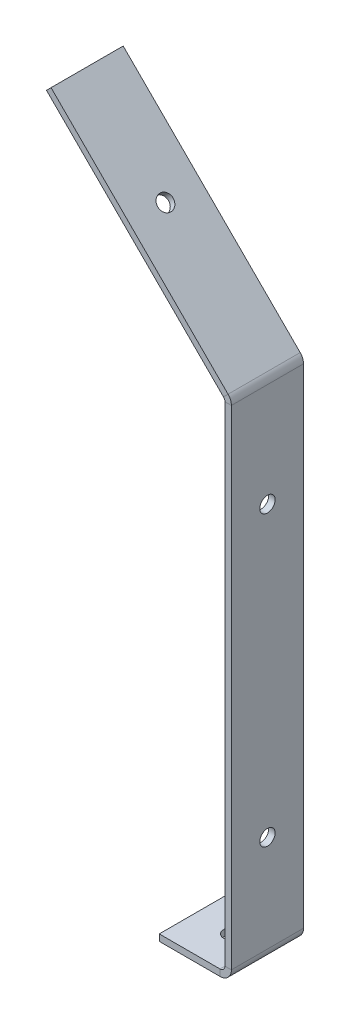
ISO-10303-21;
HEADER;
FILE_DESCRIPTION(('STEP AP214'),'2;1');
FILE_NAME('part.step','',(''),(''),'','','');
FILE_SCHEMA(('AUTOMOTIVE_DESIGN { 1 0 10303 214 1 1 1 1 }'));
ENDSEC;
DATA;
#1=APPLICATION_CONTEXT('core data for automotive mechanical design processes');
#2=APPLICATION_PROTOCOL_DEFINITION('international standard','automotive_design',2000,#1);
#3=PRODUCT_CONTEXT('',#1,'mechanical');
#4=PRODUCT('Part','Part','',(#3));
#5=PRODUCT_RELATED_PRODUCT_CATEGORY('part','',(#4));
#6=PRODUCT_DEFINITION_FORMATION('','',#4);
#7=PRODUCT_DEFINITION_CONTEXT('part definition',#1,'design');
#8=PRODUCT_DEFINITION('design','',#6,#7);
#9=PRODUCT_DEFINITION_SHAPE('','',#8);
#10=(LENGTH_UNIT() NAMED_UNIT(*) SI_UNIT(.MILLI.,.METRE.));
#11=(NAMED_UNIT(*) PLANE_ANGLE_UNIT() SI_UNIT($,.RADIAN.));
#12=(NAMED_UNIT(*) SI_UNIT($,.STERADIAN.) SOLID_ANGLE_UNIT());
#13=UNCERTAINTY_MEASURE_WITH_UNIT(LENGTH_MEASURE(1.E-05),#10,'distance_accuracy_value','');
#14=(GEOMETRIC_REPRESENTATION_CONTEXT(3) GLOBAL_UNCERTAINTY_ASSIGNED_CONTEXT((#13)) GLOBAL_UNIT_ASSIGNED_CONTEXT((#10,
#11,#12)) REPRESENTATION_CONTEXT('',''));
#15=CARTESIAN_POINT('',(0.,0.,0.));
#16=DIRECTION('',(0.,0.,1.));
#17=DIRECTION('',(1.,0.,0.));
#18=AXIS2_PLACEMENT_3D('',#15,#16,#17);
#19=CARTESIAN_POINT('',(0.,176.137678131484,25.4));
#20=DIRECTION('',(0.,0.,1.));
#21=DIRECTION('',(1.,0.,0.));
#22=AXIS2_PLACEMENT_3D('',#19,#20,#21);
#23=PLANE('',#22);
#24=DIRECTION('',(-1.,0.,0.));
#25=VECTOR('',#24,1.);
#26=CARTESIAN_POINT('',(0.,176.137678131484,25.4));
#27=LINE('',#26,#25);
#28=CARTESIAN_POINT('',(0.,176.137678131484,25.4));
#29=VERTEX_POINT('',#28);
#30=CARTESIAN_POINT('',(-2.28599999999998,176.137678131484,25.4));
#31=VERTEX_POINT('',#30);
#32=EDGE_CURVE('E11',#29,#31,#27,.T.);
#33=ORIENTED_EDGE('',*,*,#32,.F.);
#34=CARTESIAN_POINT('',(-4.01319999999998,176.137678131484,25.4));
#35=DIRECTION('',(0.,0.,1.));
#36=DIRECTION('',(1.,0.,0.));
#37=AXIS2_PLACEMENT_3D('',#34,#35,#36);
#38=CIRCLE('',#37,4.0132);
#39=CARTESIAN_POINT('',(-1.17543906574211,178.975439065742,25.4));
#40=VERTEX_POINT('',#39);
#41=EDGE_CURVE('E175',#29,#40,#38,.T.);
#42=ORIENTED_EDGE('',*,*,#41,.T.);
#43=DIRECTION('',(0.707106781186545,0.70710678118655,0.));
#44=VECTOR('',#43,1.);
#45=CARTESIAN_POINT('',(-2.79188516753455,177.35899296395,25.4));
#46=LINE('',#45,#44);
#47=CARTESIAN_POINT('',(-2.79188516753455,177.35899296395,25.4));
#48=VERTEX_POINT('',#47);
#49=EDGE_CURVE('E50',#48,#40,#46,.T.);
#50=ORIENTED_EDGE('',*,*,#49,.F.);
#51=CARTESIAN_POINT('',(-4.01319999999998,176.137678131484,25.4));
#52=DIRECTION('',(0.,0.,1.));
#53=DIRECTION('',(1.,0.,0.));
#54=AXIS2_PLACEMENT_3D('',#51,#52,#53);
#55=CIRCLE('',#54,1.7272);
#56=EDGE_CURVE('E252',#31,#48,#55,.T.);
#57=ORIENTED_EDGE('',*,*,#56,.F.);
#58=EDGE_LOOP('',(#33,#42,#50,#57));
#59=FACE_BOUND('',#58,.T.);
#60=ADVANCED_FACE('F42',(#59),#23,.T.);
#61=CARTESIAN_POINT('',(-2.79188516753455,177.35899296395,25.4));
#62=DIRECTION('',(0.,0.,1.));
#63=DIRECTION('',(1.,0.,0.));
#64=AXIS2_PLACEMENT_3D('',#61,#62,#63);
#65=PLANE('',#64);
#66=DIRECTION('',(0.,1.,0.));
#67=VECTOR('',#66,1.);
#68=CARTESIAN_POINT('',(0.,0.,25.4));
#69=LINE('',#68,#67);
#70=CARTESIAN_POINT('',(0.,4.0132,25.4));
#71=VERTEX_POINT('',#70);
#72=EDGE_CURVE('E142',#71,#29,#69,.T.);
#73=ORIENTED_EDGE('',*,*,#72,.T.);
#74=ORIENTED_EDGE('',*,*,#32,.T.);
#75=DIRECTION('',(0.,1.,0.));
#76=VECTOR('',#75,1.);
#77=CARTESIAN_POINT('',(-2.286,0.,25.4));
#78=LINE('',#77,#76);
#79=CARTESIAN_POINT('',(-2.286,4.0132,25.4));
#80=VERTEX_POINT('',#79);
#81=EDGE_CURVE('E145',#80,#31,#78,.T.);
#82=ORIENTED_EDGE('',*,*,#81,.F.);
#83=DIRECTION('',(1.,0.,0.));
#84=VECTOR('',#83,1.);
#85=CARTESIAN_POINT('',(-2.286,4.0132,25.4));
#86=LINE('',#85,#84);
#87=EDGE_CURVE('E138',#80,#71,#86,.T.);
#88=ORIENTED_EDGE('',*,*,#87,.T.);
#89=EDGE_LOOP('',(#73,#74,#82,#88));
#90=FACE_BOUND('',#89,.T.);
#91=ADVANCED_FACE('F140',(#90),#65,.T.);
#92=CARTESIAN_POINT('',(-1.17543906574211,178.975439065742,0.));
#93=DIRECTION('',(0.,0.,-1.));
#94=DIRECTION('',(-1.,0.,0.));
#95=AXIS2_PLACEMENT_3D('',#92,#93,#94);
#96=PLANE('',#95);
#97=DIRECTION('',(-0.707106781186545,-0.70710678118655,0.));
#98=VECTOR('',#97,1.);
#99=CARTESIAN_POINT('',(-1.17543906574211,178.975439065742,0.));
#100=LINE('',#99,#98);
#101=CARTESIAN_POINT('',(-1.17543906574211,178.975439065742,0.));
#102=VERTEX_POINT('',#101);
#103=CARTESIAN_POINT('',(-2.79188516753455,177.35899296395,0.));
#104=VERTEX_POINT('',#103);
#105=EDGE_CURVE('E105',#102,#104,#100,.T.);
#106=ORIENTED_EDGE('',*,*,#105,.F.);
#107=CARTESIAN_POINT('',(-4.01319999999998,176.137678131484,0.));
#108=DIRECTION('',(0.,0.,1.));
#109=DIRECTION('',(1.,0.,0.));
#110=AXIS2_PLACEMENT_3D('',#107,#108,#109);
#111=CIRCLE('',#110,4.0132);
#112=CARTESIAN_POINT('',(0.,176.137678131484,0.));
#113=VERTEX_POINT('',#112);
#114=EDGE_CURVE('E210',#113,#102,#111,.T.);
#115=ORIENTED_EDGE('',*,*,#114,.F.);
#116=DIRECTION('',(1.,0.,0.));
#117=VECTOR('',#116,1.);
#118=CARTESIAN_POINT('',(-2.28599999999998,176.137678131484,0.));
#119=LINE('',#118,#117);
#120=CARTESIAN_POINT('',(-2.28599999999998,176.137678131484,0.));
#121=VERTEX_POINT('',#120);
#122=EDGE_CURVE('E98',#121,#113,#119,.T.);
#123=ORIENTED_EDGE('',*,*,#122,.F.);
#124=CARTESIAN_POINT('',(-4.01319999999998,176.137678131484,0.));
#125=DIRECTION('',(0.,0.,1.));
#126=DIRECTION('',(1.,0.,0.));
#127=AXIS2_PLACEMENT_3D('',#124,#125,#126);
#128=CIRCLE('',#127,1.7272);
#129=EDGE_CURVE('E191',#121,#104,#128,.T.);
#130=ORIENTED_EDGE('',*,*,#129,.T.);
#131=EDGE_LOOP('',(#106,#115,#123,#130));
#132=FACE_BOUND('',#131,.T.);
#133=ADVANCED_FACE('F257',(#132),#96,.T.);
#134=CARTESIAN_POINT('',(-2.28599999999998,176.137678131484,0.));
#135=DIRECTION('',(0.,0.,-1.));
#136=DIRECTION('',(-1.,0.,0.));
#137=AXIS2_PLACEMENT_3D('',#134,#135,#136);
#138=PLANE('',#137);
#139=DIRECTION('',(-0.707106781186549,0.707106781186546,0.));
#140=VECTOR('',#139,1.);
#141=CARTESIAN_POINT('',(0.,177.8,0.));
#142=LINE('',#141,#140);
#143=CARTESIAN_POINT('',(-63.5,241.3,0.));
#144=VERTEX_POINT('',#143);
#145=EDGE_CURVE('E181',#102,#144,#142,.T.);
#146=ORIENTED_EDGE('',*,*,#145,.F.);
#147=ORIENTED_EDGE('',*,*,#105,.T.);
#148=DIRECTION('',(-0.707106781186549,0.707106781186546,0.));
#149=VECTOR('',#148,1.);
#150=CARTESIAN_POINT('',(-1.61644610179244,176.183553898208,0.));
#151=LINE('',#150,#149);
#152=CARTESIAN_POINT('',(-65.1164461017924,239.683553898207,0.));
#153=VERTEX_POINT('',#152);
#154=EDGE_CURVE('E188',#104,#153,#151,.T.);
#155=ORIENTED_EDGE('',*,*,#154,.T.);
#156=DIRECTION('',(0.707106781186545,0.707106781186551,0.));
#157=VECTOR('',#156,1.);
#158=CARTESIAN_POINT('',(-65.1164461017924,239.683553898207,0.));
#159=LINE('',#158,#157);
#160=EDGE_CURVE('E184',#153,#144,#159,.T.);
#161=ORIENTED_EDGE('',*,*,#160,.T.);
#162=EDGE_LOOP('',(#146,#147,#155,#161));
#163=FACE_BOUND('',#162,.T.);
#164=ADVANCED_FACE('F243',(#163),#138,.T.);
#165=CARTESIAN_POINT('',(-4.0132,0.,25.4));
#166=DIRECTION('',(0.,0.,1.));
#167=DIRECTION('',(1.,0.,0.));
#168=AXIS2_PLACEMENT_3D('',#165,#166,#167);
#169=PLANE('',#168);
#170=DIRECTION('',(0.,1.,0.));
#171=VECTOR('',#170,1.);
#172=CARTESIAN_POINT('',(-4.0132,0.,25.4));
#173=LINE('',#172,#171);
#174=CARTESIAN_POINT('',(-4.0132,0.,25.4));
#175=VERTEX_POINT('',#174);
#176=CARTESIAN_POINT('',(-4.0132,2.286,25.4));
#177=VERTEX_POINT('',#176);
#178=EDGE_CURVE('E150',#175,#177,#173,.T.);
#179=ORIENTED_EDGE('',*,*,#178,.F.);
#180=CARTESIAN_POINT('',(-4.0132,4.0132,25.4));
#181=DIRECTION('',(0.,0.,1.));
#182=DIRECTION('',(1.,0.,0.));
#183=AXIS2_PLACEMENT_3D('',#180,#181,#182);
#184=CIRCLE('',#183,4.0132);
#185=EDGE_CURVE('E154',#175,#71,#184,.T.);
#186=ORIENTED_EDGE('',*,*,#185,.T.);
#187=ORIENTED_EDGE('',*,*,#87,.F.);
#188=CARTESIAN_POINT('',(-4.0132,4.0132,25.4));
#189=DIRECTION('',(0.,0.,1.));
#190=DIRECTION('',(1.,0.,0.));
#191=AXIS2_PLACEMENT_3D('',#188,#189,#190);
#192=CIRCLE('',#191,1.7272);
#193=EDGE_CURVE('E264',#177,#80,#192,.T.);
#194=ORIENTED_EDGE('',*,*,#193,.F.);
#195=EDGE_LOOP('',(#179,#186,#187,#194));
#196=FACE_BOUND('',#195,.T.);
#197=ADVANCED_FACE('F156',(#196),#169,.T.);
#198=CARTESIAN_POINT('',(-2.286,4.0132,25.4));
#199=DIRECTION('',(0.,0.,1.));
#200=DIRECTION('',(1.,0.,0.));
#201=AXIS2_PLACEMENT_3D('',#198,#199,#200);
#202=PLANE('',#201);
#203=DIRECTION('',(1.,0.,0.));
#204=VECTOR('',#203,1.);
#205=CARTESIAN_POINT('',(0.,0.,25.4));
#206=LINE('',#205,#204);
#207=CARTESIAN_POINT('',(-25.4,0.,25.4));
#208=VERTEX_POINT('',#207);
#209=EDGE_CURVE('E160',#208,#175,#206,.T.);
#210=ORIENTED_EDGE('',*,*,#209,.T.);
#211=ORIENTED_EDGE('',*,*,#178,.T.);
#212=DIRECTION('',(1.,0.,0.));
#213=VECTOR('',#212,1.);
#214=CARTESIAN_POINT('',(0.,2.286,25.4));
#215=LINE('',#214,#213);
#216=CARTESIAN_POINT('',(-25.4,2.286,25.4));
#217=VERTEX_POINT('',#216);
#218=EDGE_CURVE('E271',#217,#177,#215,.T.);
#219=ORIENTED_EDGE('',*,*,#218,.F.);
#220=DIRECTION('',(0.,1.,0.));
#221=VECTOR('',#220,1.);
#222=CARTESIAN_POINT('',(-25.4,0.,25.4));
#223=LINE('',#222,#221);
#224=EDGE_CURVE('E274',#208,#217,#223,.T.);
#225=ORIENTED_EDGE('',*,*,#224,.F.);
#226=EDGE_LOOP('',(#210,#211,#219,#225));
#227=FACE_BOUND('',#226,.T.);
#228=ADVANCED_FACE('F280',(#227),#202,.T.);
#229=CARTESIAN_POINT('',(0.,4.0132,0.));
#230=DIRECTION('',(0.,0.,-1.));
#231=DIRECTION('',(-1.,0.,0.));
#232=AXIS2_PLACEMENT_3D('',#229,#230,#231);
#233=PLANE('',#232);
#234=DIRECTION('',(-1.,0.,0.));
#235=VECTOR('',#234,1.);
#236=CARTESIAN_POINT('',(0.,4.0132,0.));
#237=LINE('',#236,#235);
#238=CARTESIAN_POINT('',(0.,4.0132,0.));
#239=VERTEX_POINT('',#238);
#240=CARTESIAN_POINT('',(-2.286,4.0132,0.));
#241=VERTEX_POINT('',#240);
#242=EDGE_CURVE('E151',#239,#241,#237,.T.);
#243=ORIENTED_EDGE('',*,*,#242,.F.);
#244=CARTESIAN_POINT('',(-4.0132,4.0132,0.));
#245=DIRECTION('',(0.,0.,1.));
#246=DIRECTION('',(1.,0.,0.));
#247=AXIS2_PLACEMENT_3D('',#244,#245,#246);
#248=CIRCLE('',#247,4.0132);
#249=CARTESIAN_POINT('',(-4.0132,0.,0.));
#250=VERTEX_POINT('',#249);
#251=EDGE_CURVE('E167',#250,#239,#248,.T.);
#252=ORIENTED_EDGE('',*,*,#251,.F.);
#253=DIRECTION('',(0.,-1.,0.));
#254=VECTOR('',#253,1.);
#255=CARTESIAN_POINT('',(-4.0132,2.286,0.));
#256=LINE('',#255,#254);
#257=CARTESIAN_POINT('',(-4.0132,2.286,0.));
#258=VERTEX_POINT('',#257);
#259=EDGE_CURVE('E236',#258,#250,#256,.T.);
#260=ORIENTED_EDGE('',*,*,#259,.F.);
#261=CARTESIAN_POINT('',(-4.0132,4.0132,0.));
#262=DIRECTION('',(0.,0.,1.));
#263=DIRECTION('',(1.,0.,0.));
#264=AXIS2_PLACEMENT_3D('',#261,#262,#263);
#265=CIRCLE('',#264,1.7272);
#266=EDGE_CURVE('E195',#258,#241,#265,.T.);
#267=ORIENTED_EDGE('',*,*,#266,.T.);
#268=EDGE_LOOP('',(#243,#252,#260,#267));
#269=FACE_BOUND('',#268,.T.);
#270=ADVANCED_FACE('F287',(#269),#233,.T.);
#271=CARTESIAN_POINT('',(-4.0132,2.286,0.));
#272=DIRECTION('',(0.,0.,-1.));
#273=DIRECTION('',(-1.,0.,0.));
#274=AXIS2_PLACEMENT_3D('',#271,#272,#273);
#275=PLANE('',#274);
#276=DIRECTION('',(0.,1.,0.));
#277=VECTOR('',#276,1.);
#278=CARTESIAN_POINT('',(0.,0.,0.));
#279=LINE('',#278,#277);
#280=EDGE_CURVE('E208',#239,#113,#279,.T.);
#281=ORIENTED_EDGE('',*,*,#280,.F.);
#282=ORIENTED_EDGE('',*,*,#242,.T.);
#283=DIRECTION('',(0.,1.,0.));
#284=VECTOR('',#283,1.);
#285=CARTESIAN_POINT('',(-2.286,0.,0.));
#286=LINE('',#285,#284);
#287=EDGE_CURVE('E193',#241,#121,#286,.T.);
#288=ORIENTED_EDGE('',*,*,#287,.T.);
#289=ORIENTED_EDGE('',*,*,#122,.T.);
#290=EDGE_LOOP('',(#281,#282,#288,#289));
#291=FACE_BOUND('',#290,.T.);
#292=ADVANCED_FACE('F289',(#291),#275,.T.);
#293=CARTESIAN_POINT('',(0.,177.8,25.4));
#294=DIRECTION('',(-0.707106781186546,-0.707106781186549,0.));
#295=DIRECTION('',(0.707106781186549,-0.707106781186546,0.));
#296=AXIS2_PLACEMENT_3D('',#293,#294,#295);
#297=PLANE('',#296);
#298=CARTESIAN_POINT('',(-35.9210244842766,213.721024484277,12.7));
#299=DIRECTION('',(0.707106781186546,0.707106781186549,0.));
#300=DIRECTION('',(-0.707106781186549,0.707106781186546,0.));
#301=AXIS2_PLACEMENT_3D('',#298,#299,#300);
#302=CIRCLE('',#301,2.7051);
#303=CARTESIAN_POINT('',(-37.8338190380643,215.633819038064,12.7));
#304=VERTEX_POINT('',#303);
#305=EDGE_CURVE('E381',#304,#304,#302,.T.);
#306=ORIENTED_EDGE('',*,*,#305,.F.);
#307=EDGE_LOOP('',(#306));
#308=FACE_BOUND('',#307,.T.);
#309=ORIENTED_EDGE('',*,*,#145,.T.);
#310=DIRECTION('',(0.,0.,-1.));
#311=VECTOR('',#310,1.);
#312=CARTESIAN_POINT('',(-63.5,241.3,25.4));
#313=LINE('',#312,#311);
#314=CARTESIAN_POINT('',(-63.5,241.3,25.4));
#315=VERTEX_POINT('',#314);
#316=EDGE_CURVE('E234',#315,#144,#313,.T.);
#317=ORIENTED_EDGE('',*,*,#316,.F.);
#318=DIRECTION('',(-0.707106781186549,0.707106781186546,0.));
#319=VECTOR('',#318,1.);
#320=CARTESIAN_POINT('',(0.,177.8,25.4));
#321=LINE('',#320,#319);
#322=EDGE_CURVE('E111',#40,#315,#321,.T.);
#323=ORIENTED_EDGE('',*,*,#322,.F.);
#324=DIRECTION('',(0.,0.,-1.));
#325=VECTOR('',#324,1.);
#326=CARTESIAN_POINT('',(-1.17543906574211,178.975439065742,25.4));
#327=LINE('',#326,#325);
#328=EDGE_CURVE('E177',#40,#102,#327,.T.);
#329=ORIENTED_EDGE('',*,*,#328,.T.);
#330=EDGE_LOOP('',(#309,#317,#323,#329));
#331=FACE_BOUND('',#330,.T.);
#332=ADVANCED_FACE('F333',(#308,#331),#297,.F.);
#333=CARTESIAN_POINT('',(-65.1164461017924,239.683553898207,25.4));
#334=DIRECTION('',(-0.70710678118655,0.707106781186544,0.));
#335=DIRECTION('',(-0.707106781186545,-0.707106781186551,0.));
#336=AXIS2_PLACEMENT_3D('',#333,#334,#335);
#337=PLANE('',#336);
#338=ORIENTED_EDGE('',*,*,#160,.F.);
#339=DIRECTION('',(0.,0.,-1.));
#340=VECTOR('',#339,1.);
#341=CARTESIAN_POINT('',(-65.1164461017924,239.683553898207,25.4));
#342=LINE('',#341,#340);
#343=CARTESIAN_POINT('',(-65.1164461017924,239.683553898207,25.4));
#344=VERTEX_POINT('',#343);
#345=EDGE_CURVE('E232',#344,#153,#342,.T.);
#346=ORIENTED_EDGE('',*,*,#345,.F.);
#347=DIRECTION('',(0.707106781186545,0.707106781186551,0.));
#348=VECTOR('',#347,1.);
#349=CARTESIAN_POINT('',(-65.1164461017924,239.683553898207,25.4));
#350=LINE('',#349,#348);
#351=EDGE_CURVE('E266',#344,#315,#350,.T.);
#352=ORIENTED_EDGE('',*,*,#351,.T.);
#353=ORIENTED_EDGE('',*,*,#316,.T.);
#354=EDGE_LOOP('',(#338,#346,#352,#353));
#355=FACE_BOUND('',#354,.T.);
#356=ADVANCED_FACE('F336',(#355),#337,.T.);
#357=CARTESIAN_POINT('',(-1.61644610179244,176.183553898208,25.4));
#358=DIRECTION('',(-0.707106781186546,-0.707106781186549,0.));
#359=DIRECTION('',(0.707106781186549,-0.707106781186546,0.));
#360=AXIS2_PLACEMENT_3D('',#357,#358,#359);
#361=PLANE('',#360);
#362=CARTESIAN_POINT('',(-37.5374705860691,212.104578382484,12.7));
#363=DIRECTION('',(-0.707106781186546,-0.707106781186549,0.));
#364=DIRECTION('',(0.707106781186549,-0.707106781186546,0.));
#365=AXIS2_PLACEMENT_3D('',#362,#363,#364);
#366=CIRCLE('',#365,2.7051);
#367=CARTESIAN_POINT('',(-35.6246760322814,210.191783828696,12.7));
#368=VERTEX_POINT('',#367);
#369=EDGE_CURVE('E384',#368,#368,#366,.F.);
#370=ORIENTED_EDGE('',*,*,#369,.T.);
#371=EDGE_LOOP('',(#370));
#372=FACE_BOUND('',#371,.T.);
#373=ORIENTED_EDGE('',*,*,#154,.F.);
#374=DIRECTION('',(0.,0.,-1.));
#375=VECTOR('',#374,1.);
#376=CARTESIAN_POINT('',(-2.79188516753455,177.35899296395,25.4));
#377=LINE('',#376,#375);
#378=EDGE_CURVE('E229',#48,#104,#377,.T.);
#379=ORIENTED_EDGE('',*,*,#378,.F.);
#380=DIRECTION('',(-0.707106781186549,0.707106781186546,0.));
#381=VECTOR('',#380,1.);
#382=CARTESIAN_POINT('',(-1.61644610179244,176.183553898208,25.4));
#383=LINE('',#382,#381);
#384=EDGE_CURVE('E262',#48,#344,#383,.T.);
#385=ORIENTED_EDGE('',*,*,#384,.T.);
#386=ORIENTED_EDGE('',*,*,#345,.T.);
#387=EDGE_LOOP('',(#373,#379,#385,#386));
#388=FACE_BOUND('',#387,.T.);
#389=ADVANCED_FACE('F255',(#372,#388),#361,.T.);
#390=CARTESIAN_POINT('',(-4.01319999999998,176.137678131484,25.4));
#391=DIRECTION('',(0.,0.,-1.));
#392=DIRECTION('',(-1.,0.,0.));
#393=AXIS2_PLACEMENT_3D('',#390,#391,#392);
#394=CYLINDRICAL_SURFACE('',#393,1.7272);
#395=ORIENTED_EDGE('',*,*,#129,.F.);
#396=DIRECTION('',(0.,0.,-1.));
#397=VECTOR('',#396,1.);
#398=CARTESIAN_POINT('',(-2.28599999999998,176.137678131484,25.4));
#399=LINE('',#398,#397);
#400=EDGE_CURVE('E226',#31,#121,#399,.T.);
#401=ORIENTED_EDGE('',*,*,#400,.F.);
#402=ORIENTED_EDGE('',*,*,#56,.T.);
#403=ORIENTED_EDGE('',*,*,#378,.T.);
#404=EDGE_LOOP('',(#395,#401,#402,#403));
#405=FACE_BOUND('',#404,.T.);
#406=ADVANCED_FACE('F249',(#405),#394,.F.);
#407=CARTESIAN_POINT('',(-2.286,0.,25.4));
#408=DIRECTION('',(-1.,0.,0.));
#409=DIRECTION('',(0.,0.,1.));
#410=AXIS2_PLACEMENT_3D('',#407,#408,#409);
#411=PLANE('',#410);
#412=CARTESIAN_POINT('',(-2.286,139.7,12.7));
#413=DIRECTION('',(-1.,0.,0.));
#414=DIRECTION('',(0.,0.,1.));
#415=AXIS2_PLACEMENT_3D('',#412,#413,#414);
#416=CIRCLE('',#415,2.70510000000001);
#417=CARTESIAN_POINT('',(-2.286,139.7,15.4051));
#418=VERTEX_POINT('',#417);
#419=EDGE_CURVE('E378',#418,#418,#416,.F.);
#420=ORIENTED_EDGE('',*,*,#419,.T.);
#421=EDGE_LOOP('',(#420));
#422=FACE_BOUND('',#421,.T.);
#423=CARTESIAN_POINT('',(-2.286,38.1,12.7));
#424=DIRECTION('',(-1.,0.,0.));
#425=DIRECTION('',(0.,0.,1.));
#426=AXIS2_PLACEMENT_3D('',#423,#424,#425);
#427=CIRCLE('',#426,2.7051);
#428=CARTESIAN_POINT('',(-2.286,38.1,15.4051));
#429=VERTEX_POINT('',#428);
#430=EDGE_CURVE('E372',#429,#429,#427,.F.);
#431=ORIENTED_EDGE('',*,*,#430,.T.);
#432=EDGE_LOOP('',(#431));
#433=FACE_BOUND('',#432,.T.);
#434=ORIENTED_EDGE('',*,*,#287,.F.);
#435=DIRECTION('',(0.,0.,-1.));
#436=VECTOR('',#435,1.);
#437=CARTESIAN_POINT('',(-2.286,4.0132,25.4));
#438=LINE('',#437,#436);
#439=EDGE_CURVE('E223',#80,#241,#438,.T.);
#440=ORIENTED_EDGE('',*,*,#439,.F.);
#441=ORIENTED_EDGE('',*,*,#81,.T.);
#442=ORIENTED_EDGE('',*,*,#400,.T.);
#443=EDGE_LOOP('',(#434,#440,#441,#442));
#444=FACE_BOUND('',#443,.T.);
#445=ADVANCED_FACE('F260',(#422,#433,#444),#411,.T.);
#446=CARTESIAN_POINT('',(-4.0132,4.0132,25.4));
#447=DIRECTION('',(0.,0.,-1.));
#448=DIRECTION('',(-1.,0.,0.));
#449=AXIS2_PLACEMENT_3D('',#446,#447,#448);
#450=CYLINDRICAL_SURFACE('',#449,1.7272);
#451=ORIENTED_EDGE('',*,*,#266,.F.);
#452=DIRECTION('',(0.,0.,-1.));
#453=VECTOR('',#452,1.);
#454=CARTESIAN_POINT('',(-4.0132,2.286,25.4));
#455=LINE('',#454,#453);
#456=EDGE_CURVE('E220',#177,#258,#455,.T.);
#457=ORIENTED_EDGE('',*,*,#456,.F.);
#458=ORIENTED_EDGE('',*,*,#193,.T.);
#459=ORIENTED_EDGE('',*,*,#439,.T.);
#460=EDGE_LOOP('',(#451,#457,#458,#459));
#461=FACE_BOUND('',#460,.T.);
#462=ADVANCED_FACE('F291',(#461),#450,.F.);
#463=CARTESIAN_POINT('',(0.,2.286,25.4));
#464=DIRECTION('',(0.,1.,0.));
#465=DIRECTION('',(-1.,0.,0.));
#466=AXIS2_PLACEMENT_3D('',#463,#464,#465);
#467=PLANE('',#466);
#468=CARTESIAN_POINT('',(-12.7,2.28600000000001,12.7));
#469=DIRECTION('',(0.,1.,0.));
#470=DIRECTION('',(-1.,0.,0.));
#471=AXIS2_PLACEMENT_3D('',#468,#469,#470);
#472=CIRCLE('',#471,2.7051);
#473=CARTESIAN_POINT('',(-15.4051,2.28600000000001,12.7));
#474=VERTEX_POINT('',#473);
#475=EDGE_CURVE('E390',#474,#474,#472,.F.);
#476=ORIENTED_EDGE('',*,*,#475,.T.);
#477=EDGE_LOOP('',(#476));
#478=FACE_BOUND('',#477,.T.);
#479=DIRECTION('',(1.,0.,0.));
#480=VECTOR('',#479,1.);
#481=CARTESIAN_POINT('',(0.,2.286,0.));
#482=LINE('',#481,#480);
#483=CARTESIAN_POINT('',(-25.4,2.286,0.));
#484=VERTEX_POINT('',#483);
#485=EDGE_CURVE('E198',#484,#258,#482,.T.);
#486=ORIENTED_EDGE('',*,*,#485,.F.);
#487=DIRECTION('',(0.,0.,-1.));
#488=VECTOR('',#487,1.);
#489=CARTESIAN_POINT('',(-25.4,2.286,25.4));
#490=LINE('',#489,#488);
#491=EDGE_CURVE('E218',#217,#484,#490,.T.);
#492=ORIENTED_EDGE('',*,*,#491,.F.);
#493=ORIENTED_EDGE('',*,*,#218,.T.);
#494=ORIENTED_EDGE('',*,*,#456,.T.);
#495=EDGE_LOOP('',(#486,#492,#493,#494));
#496=FACE_BOUND('',#495,.T.);
#497=ADVANCED_FACE('F294',(#478,#496),#467,.T.);
#498=CARTESIAN_POINT('',(-25.4,0.,25.4));
#499=DIRECTION('',(-1.,0.,0.));
#500=DIRECTION('',(0.,0.,1.));
#501=AXIS2_PLACEMENT_3D('',#498,#499,#500);
#502=PLANE('',#501);
#503=DIRECTION('',(0.,1.,0.));
#504=VECTOR('',#503,1.);
#505=CARTESIAN_POINT('',(-25.4,0.,0.));
#506=LINE('',#505,#504);
#507=CARTESIAN_POINT('',(-25.4,0.,0.));
#508=VERTEX_POINT('',#507);
#509=EDGE_CURVE('E201',#508,#484,#506,.T.);
#510=ORIENTED_EDGE('',*,*,#509,.F.);
#511=DIRECTION('',(0.,0.,-1.));
#512=VECTOR('',#511,1.);
#513=CARTESIAN_POINT('',(-25.4,0.,25.4));
#514=LINE('',#513,#512);
#515=EDGE_CURVE('E216',#208,#508,#514,.T.);
#516=ORIENTED_EDGE('',*,*,#515,.F.);
#517=ORIENTED_EDGE('',*,*,#224,.T.);
#518=ORIENTED_EDGE('',*,*,#491,.T.);
#519=EDGE_LOOP('',(#510,#516,#517,#518));
#520=FACE_BOUND('',#519,.T.);
#521=ADVANCED_FACE('F297',(#520),#502,.T.);
#522=CARTESIAN_POINT('',(0.,0.,25.4));
#523=DIRECTION('',(0.,1.,0.));
#524=DIRECTION('',(-1.,0.,0.));
#525=AXIS2_PLACEMENT_3D('',#522,#523,#524);
#526=PLANE('',#525);
#527=CARTESIAN_POINT('',(-12.7,0.,12.7));
#528=DIRECTION('',(0.,-1.,0.));
#529=DIRECTION('',(1.,0.,0.));
#530=AXIS2_PLACEMENT_3D('',#527,#528,#529);
#531=CIRCLE('',#530,2.7051);
#532=CARTESIAN_POINT('',(-9.9949,0.,12.7));
#533=VERTEX_POINT('',#532);
#534=EDGE_CURVE('E387',#533,#533,#531,.T.);
#535=ORIENTED_EDGE('',*,*,#534,.F.);
#536=EDGE_LOOP('',(#535));
#537=FACE_BOUND('',#536,.T.);
#538=DIRECTION('',(1.,0.,0.));
#539=VECTOR('',#538,1.);
#540=CARTESIAN_POINT('',(0.,0.,0.));
#541=LINE('',#540,#539);
#542=EDGE_CURVE('E204',#508,#250,#541,.T.);
#543=ORIENTED_EDGE('',*,*,#542,.T.);
#544=DIRECTION('',(0.,0.,-1.));
#545=VECTOR('',#544,1.);
#546=CARTESIAN_POINT('',(-4.0132,0.,25.4));
#547=LINE('',#546,#545);
#548=EDGE_CURVE('E169',#175,#250,#547,.T.);
#549=ORIENTED_EDGE('',*,*,#548,.F.);
#550=ORIENTED_EDGE('',*,*,#209,.F.);
#551=ORIENTED_EDGE('',*,*,#515,.T.);
#552=EDGE_LOOP('',(#543,#549,#550,#551));
#553=FACE_BOUND('',#552,.T.);
#554=ADVANCED_FACE('F284',(#537,#553),#526,.F.);
#555=CARTESIAN_POINT('',(-4.0132,4.0132,25.4));
#556=DIRECTION('',(0.,0.,-1.));
#557=DIRECTION('',(-1.,0.,0.));
#558=AXIS2_PLACEMENT_3D('',#555,#556,#557);
#559=CYLINDRICAL_SURFACE('',#558,4.0132);
#560=ORIENTED_EDGE('',*,*,#251,.T.);
#561=DIRECTION('',(0.,0.,-1.));
#562=VECTOR('',#561,1.);
#563=CARTESIAN_POINT('',(0.,4.0132,25.4));
#564=LINE('',#563,#562);
#565=EDGE_CURVE('E164',#71,#239,#564,.T.);
#566=ORIENTED_EDGE('',*,*,#565,.F.);
#567=ORIENTED_EDGE('',*,*,#185,.F.);
#568=ORIENTED_EDGE('',*,*,#548,.T.);
#569=EDGE_LOOP('',(#560,#566,#567,#568));
#570=FACE_BOUND('',#569,.T.);
#571=ADVANCED_FACE('F165',(#570),#559,.T.);
#572=CARTESIAN_POINT('',(0.,0.,25.4));
#573=DIRECTION('',(-1.,0.,0.));
#574=DIRECTION('',(0.,0.,1.));
#575=AXIS2_PLACEMENT_3D('',#572,#573,#574);
#576=PLANE('',#575);
#577=CARTESIAN_POINT('',(0.,139.7,12.7));
#578=DIRECTION('',(1.,0.,0.));
#579=DIRECTION('',(0.,0.,-1.));
#580=AXIS2_PLACEMENT_3D('',#577,#578,#579);
#581=CIRCLE('',#580,2.70510000000001);
#582=CARTESIAN_POINT('',(0.,139.7,9.9949));
#583=VERTEX_POINT('',#582);
#584=EDGE_CURVE('E375',#583,#583,#581,.T.);
#585=ORIENTED_EDGE('',*,*,#584,.F.);
#586=EDGE_LOOP('',(#585));
#587=FACE_BOUND('',#586,.T.);
#588=CARTESIAN_POINT('',(0.,38.1,12.7));
#589=DIRECTION('',(1.,0.,0.));
#590=DIRECTION('',(0.,0.,-1.));
#591=AXIS2_PLACEMENT_3D('',#588,#589,#590);
#592=CIRCLE('',#591,2.7051);
#593=CARTESIAN_POINT('',(0.,38.1,9.9949));
#594=VERTEX_POINT('',#593);
#595=EDGE_CURVE('E185',#594,#594,#592,.T.);
#596=ORIENTED_EDGE('',*,*,#595,.F.);
#597=EDGE_LOOP('',(#596));
#598=FACE_BOUND('',#597,.T.);
#599=ORIENTED_EDGE('',*,*,#280,.T.);
#600=DIRECTION('',(0.,0.,-1.));
#601=VECTOR('',#600,1.);
#602=CARTESIAN_POINT('',(0.,176.137678131484,25.4));
#603=LINE('',#602,#601);
#604=EDGE_CURVE('E170',#29,#113,#603,.T.);
#605=ORIENTED_EDGE('',*,*,#604,.F.);
#606=ORIENTED_EDGE('',*,*,#72,.F.);
#607=ORIENTED_EDGE('',*,*,#565,.T.);
#608=EDGE_LOOP('',(#599,#605,#606,#607));
#609=FACE_BOUND('',#608,.T.);
#610=ADVANCED_FACE('F172',(#587,#598,#609),#576,.F.);
#611=CARTESIAN_POINT('',(-4.01319999999998,176.137678131484,25.4));
#612=DIRECTION('',(0.,0.,-1.));
#613=DIRECTION('',(-1.,0.,0.));
#614=AXIS2_PLACEMENT_3D('',#611,#612,#613);
#615=CYLINDRICAL_SURFACE('',#614,4.0132);
#616=ORIENTED_EDGE('',*,*,#114,.T.);
#617=ORIENTED_EDGE('',*,*,#328,.F.);
#618=ORIENTED_EDGE('',*,*,#41,.F.);
#619=ORIENTED_EDGE('',*,*,#604,.T.);
#620=EDGE_LOOP('',(#616,#617,#618,#619));
#621=FACE_BOUND('',#620,.T.);
#622=ADVANCED_FACE('F311',(#621),#615,.T.);
#623=CARTESIAN_POINT('',(-4.01319999999998,176.137678131484,25.4));
#624=DIRECTION('',(0.,0.,1.));
#625=DIRECTION('',(1.,0.,0.));
#626=AXIS2_PLACEMENT_3D('',#623,#624,#625);
#627=PLANE('',#626);
#628=ORIENTED_EDGE('',*,*,#322,.T.);
#629=ORIENTED_EDGE('',*,*,#351,.F.);
#630=ORIENTED_EDGE('',*,*,#384,.F.);
#631=ORIENTED_EDGE('',*,*,#49,.T.);
#632=EDGE_LOOP('',(#628,#629,#630,#631));
#633=FACE_BOUND('',#632,.T.);
#634=ADVANCED_FACE('F302',(#633),#627,.T.);
#635=CARTESIAN_POINT('',(-4.01319999999998,176.137678131484,0.));
#636=DIRECTION('',(0.,0.,1.));
#637=DIRECTION('',(1.,0.,0.));
#638=AXIS2_PLACEMENT_3D('',#635,#636,#637);
#639=PLANE('',#638);
#640=ORIENTED_EDGE('',*,*,#485,.T.);
#641=ORIENTED_EDGE('',*,*,#259,.T.);
#642=ORIENTED_EDGE('',*,*,#542,.F.);
#643=ORIENTED_EDGE('',*,*,#509,.T.);
#644=EDGE_LOOP('',(#640,#641,#642,#643));
#645=FACE_BOUND('',#644,.T.);
#646=ADVANCED_FACE('F299',(#645),#639,.F.);
#647=CARTESIAN_POINT('',(-65.1174461017924,38.1,12.7));
#648=DIRECTION('',(1.,0.,0.));
#649=DIRECTION('',(0.,0.,-1.));
#650=AXIS2_PLACEMENT_3D('',#647,#648,#649);
#651=CYLINDRICAL_SURFACE('',#650,2.7051);
#652=ORIENTED_EDGE('',*,*,#430,.F.);
#653=EDGE_LOOP('',(#652));
#654=FACE_BOUND('',#653,.T.);
#655=ORIENTED_EDGE('',*,*,#595,.T.);
#656=EDGE_LOOP('',(#655));
#657=FACE_BOUND('',#656,.T.);
#658=ADVANCED_FACE('F301',(#654,#657),#651,.F.);
#659=CARTESIAN_POINT('',(-65.1174461017924,139.7,12.7));
#660=DIRECTION('',(1.,0.,0.));
#661=DIRECTION('',(0.,0.,-1.));
#662=AXIS2_PLACEMENT_3D('',#659,#660,#661);
#663=CYLINDRICAL_SURFACE('',#662,2.70510000000001);
#664=ORIENTED_EDGE('',*,*,#419,.F.);
#665=EDGE_LOOP('',(#664));
#666=FACE_BOUND('',#665,.T.);
#667=ORIENTED_EDGE('',*,*,#584,.T.);
#668=EDGE_LOOP('',(#667));
#669=FACE_BOUND('',#668,.T.);
#670=ADVANCED_FACE('F308',(#666,#669),#663,.F.);
#671=CARTESIAN_POINT('',(-157.380247535173,92.2618014333799,12.7));
#672=DIRECTION('',(0.707106781186546,0.707106781186549,0.));
#673=DIRECTION('',(-0.707106781186549,0.707106781186546,0.));
#674=AXIS2_PLACEMENT_3D('',#671,#672,#673);
#675=CYLINDRICAL_SURFACE('',#674,2.7051);
#676=ORIENTED_EDGE('',*,*,#369,.F.);
#677=EDGE_LOOP('',(#676));
#678=FACE_BOUND('',#677,.T.);
#679=ORIENTED_EDGE('',*,*,#305,.T.);
#680=EDGE_LOOP('',(#679));
#681=FACE_BOUND('',#680,.T.);
#682=ADVANCED_FACE('F398',(#678,#681),#675,.F.);
#683=CARTESIAN_POINT('',(-12.7,241.301,12.7));
#684=DIRECTION('',(0.,-1.,0.));
#685=DIRECTION('',(1.,0.,0.));
#686=AXIS2_PLACEMENT_3D('',#683,#684,#685);
#687=CYLINDRICAL_SURFACE('',#686,2.7051);
#688=ORIENTED_EDGE('',*,*,#475,.F.);
#689=EDGE_LOOP('',(#688));
#690=FACE_BOUND('',#689,.T.);
#691=ORIENTED_EDGE('',*,*,#534,.T.);
#692=EDGE_LOOP('',(#691));
#693=FACE_BOUND('',#692,.T.);
#694=ADVANCED_FACE('F396',(#690,#693),#687,.F.);
#695=CLOSED_SHELL('',(#60,#91,#133,#164,#197,#228,#270,#292,#332,#356,#389,#406,#445,#462,#497,
#521,#554,#571,#610,#622,#634,#646,#658,#670,#682,#694));
#696=MANIFOLD_SOLID_BREP('B2',#695);
#697=ADVANCED_BREP_SHAPE_REPRESENTATION('',(#18,#696),#14);
#698=SHAPE_DEFINITION_REPRESENTATION(#9,#697);
ENDSEC;
END-ISO-10303-21;
